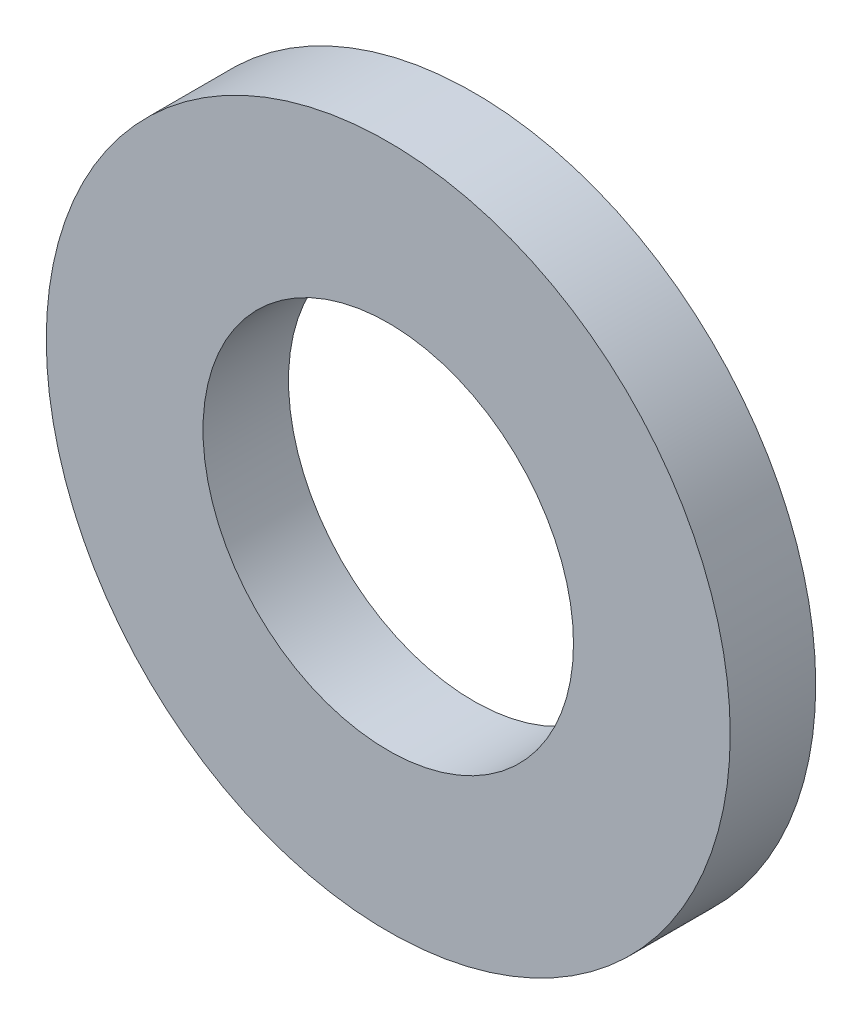
ISO-10303-21;
HEADER;
FILE_DESCRIPTION(('STEP AP214'),'2;1');
FILE_NAME('part.step','',(''),(''),'','','');
FILE_SCHEMA(('AUTOMOTIVE_DESIGN { 1 0 10303 214 1 1 1 1 }'));
ENDSEC;
DATA;
#1=APPLICATION_CONTEXT('core data for automotive mechanical design processes');
#2=APPLICATION_PROTOCOL_DEFINITION('international standard','automotive_design',2000,#1);
#3=PRODUCT_CONTEXT('',#1,'mechanical');
#4=PRODUCT('Part','Part','',(#3));
#5=PRODUCT_RELATED_PRODUCT_CATEGORY('part','',(#4));
#6=PRODUCT_DEFINITION_FORMATION('','',#4);
#7=PRODUCT_DEFINITION_CONTEXT('part definition',#1,'design');
#8=PRODUCT_DEFINITION('design','',#6,#7);
#9=PRODUCT_DEFINITION_SHAPE('','',#8);
#10=(LENGTH_UNIT() NAMED_UNIT(*) SI_UNIT(.MILLI.,.METRE.));
#11=(NAMED_UNIT(*) PLANE_ANGLE_UNIT() SI_UNIT($,.RADIAN.));
#12=(NAMED_UNIT(*) SI_UNIT($,.STERADIAN.) SOLID_ANGLE_UNIT());
#13=UNCERTAINTY_MEASURE_WITH_UNIT(LENGTH_MEASURE(1.E-05),#10,'distance_accuracy_value','');
#14=(GEOMETRIC_REPRESENTATION_CONTEXT(3) GLOBAL_UNCERTAINTY_ASSIGNED_CONTEXT((#13)) GLOBAL_UNIT_ASSIGNED_CONTEXT((#10,
#11,#12)) REPRESENTATION_CONTEXT('',''));
#15=CARTESIAN_POINT('',(0.,0.,0.));
#16=DIRECTION('',(0.,0.,1.));
#17=DIRECTION('',(1.,0.,0.));
#18=AXIS2_PLACEMENT_3D('',#15,#16,#17);
#19=CARTESIAN_POINT('',(0.,0.,3.));
#20=DIRECTION('',(0.,0.,-1.));
#21=DIRECTION('',(-1.,0.,0.));
#22=AXIS2_PLACEMENT_3D('',#19,#20,#21);
#23=CYLINDRICAL_SURFACE('',#22,12.);
#24=CARTESIAN_POINT('',(0.,0.,3.));
#25=DIRECTION('',(0.,0.,1.));
#26=DIRECTION('',(1.,0.,0.));
#27=AXIS2_PLACEMENT_3D('',#24,#25,#26);
#28=CIRCLE('',#27,12.);
#29=CARTESIAN_POINT('',(12.,0.,3.));
#30=VERTEX_POINT('',#29);
#31=EDGE_CURVE('E10',#30,#30,#28,.T.);
#32=ORIENTED_EDGE('',*,*,#31,.F.);
#33=EDGE_LOOP('',(#32));
#34=FACE_BOUND('',#33,.T.);
#35=CARTESIAN_POINT('',(0.,0.,0.));
#36=DIRECTION('',(0.,0.,1.));
#37=DIRECTION('',(1.,0.,0.));
#38=AXIS2_PLACEMENT_3D('',#35,#36,#37);
#39=CIRCLE('',#38,12.);
#40=CARTESIAN_POINT('',(12.,0.,0.));
#41=VERTEX_POINT('',#40);
#42=EDGE_CURVE('E46',#41,#41,#39,.T.);
#43=ORIENTED_EDGE('',*,*,#42,.T.);
#44=EDGE_LOOP('',(#43));
#45=FACE_BOUND('',#44,.T.);
#46=ADVANCED_FACE('F43',(#34,#45),#23,.T.);
#47=CARTESIAN_POINT('',(0.,0.,3.));
#48=DIRECTION('',(0.,0.,1.));
#49=DIRECTION('',(1.,0.,0.));
#50=AXIS2_PLACEMENT_3D('',#47,#48,#49);
#51=PLANE('',#50);
#52=CARTESIAN_POINT('',(0.,0.,3.));
#53=DIRECTION('',(0.,0.,1.));
#54=DIRECTION('',(1.,0.,0.));
#55=AXIS2_PLACEMENT_3D('',#52,#53,#54);
#56=CIRCLE('',#55,6.5);
#57=CARTESIAN_POINT('',(6.5,0.,3.));
#58=VERTEX_POINT('',#57);
#59=EDGE_CURVE('E57',#58,#58,#56,.T.);
#60=ORIENTED_EDGE('',*,*,#59,.F.);
#61=EDGE_LOOP('',(#60));
#62=FACE_BOUND('',#61,.T.);
#63=ORIENTED_EDGE('',*,*,#31,.T.);
#64=EDGE_LOOP('',(#63));
#65=FACE_BOUND('',#64,.T.);
#66=ADVANCED_FACE('F74',(#62,#65),#51,.T.);
#67=CARTESIAN_POINT('',(0.,0.,0.));
#68=DIRECTION('',(0.,0.,1.));
#69=DIRECTION('',(1.,0.,0.));
#70=AXIS2_PLACEMENT_3D('',#67,#68,#69);
#71=PLANE('',#70);
#72=CARTESIAN_POINT('',(0.,0.,0.));
#73=DIRECTION('',(0.,0.,1.));
#74=DIRECTION('',(1.,0.,0.));
#75=AXIS2_PLACEMENT_3D('',#72,#73,#74);
#76=CIRCLE('',#75,6.5);
#77=CARTESIAN_POINT('',(6.5,0.,0.));
#78=VERTEX_POINT('',#77);
#79=EDGE_CURVE('E55',#78,#78,#76,.T.);
#80=ORIENTED_EDGE('',*,*,#79,.T.);
#81=EDGE_LOOP('',(#80));
#82=FACE_BOUND('',#81,.T.);
#83=ORIENTED_EDGE('',*,*,#42,.F.);
#84=EDGE_LOOP('',(#83));
#85=FACE_BOUND('',#84,.T.);
#86=ADVANCED_FACE('F65',(#82,#85),#71,.F.);
#87=CARTESIAN_POINT('',(0.,0.,0.));
#88=DIRECTION('',(0.,0.,1.));
#89=DIRECTION('',(1.,0.,0.));
#90=AXIS2_PLACEMENT_3D('',#87,#88,#89);
#91=CYLINDRICAL_SURFACE('',#90,6.5);
#92=ORIENTED_EDGE('',*,*,#79,.F.);
#93=EDGE_LOOP('',(#92));
#94=FACE_BOUND('',#93,.T.);
#95=ORIENTED_EDGE('',*,*,#59,.T.);
#96=EDGE_LOOP('',(#95));
#97=FACE_BOUND('',#96,.T.);
#98=ADVANCED_FACE('F68',(#94,#97),#91,.F.);
#99=CLOSED_SHELL('',(#46,#66,#86,#98));
#100=MANIFOLD_SOLID_BREP('B2',#99);
#101=ADVANCED_BREP_SHAPE_REPRESENTATION('',(#18,#100),#14);
#102=SHAPE_DEFINITION_REPRESENTATION(#9,#101);
ENDSEC;
END-ISO-10303-21;
